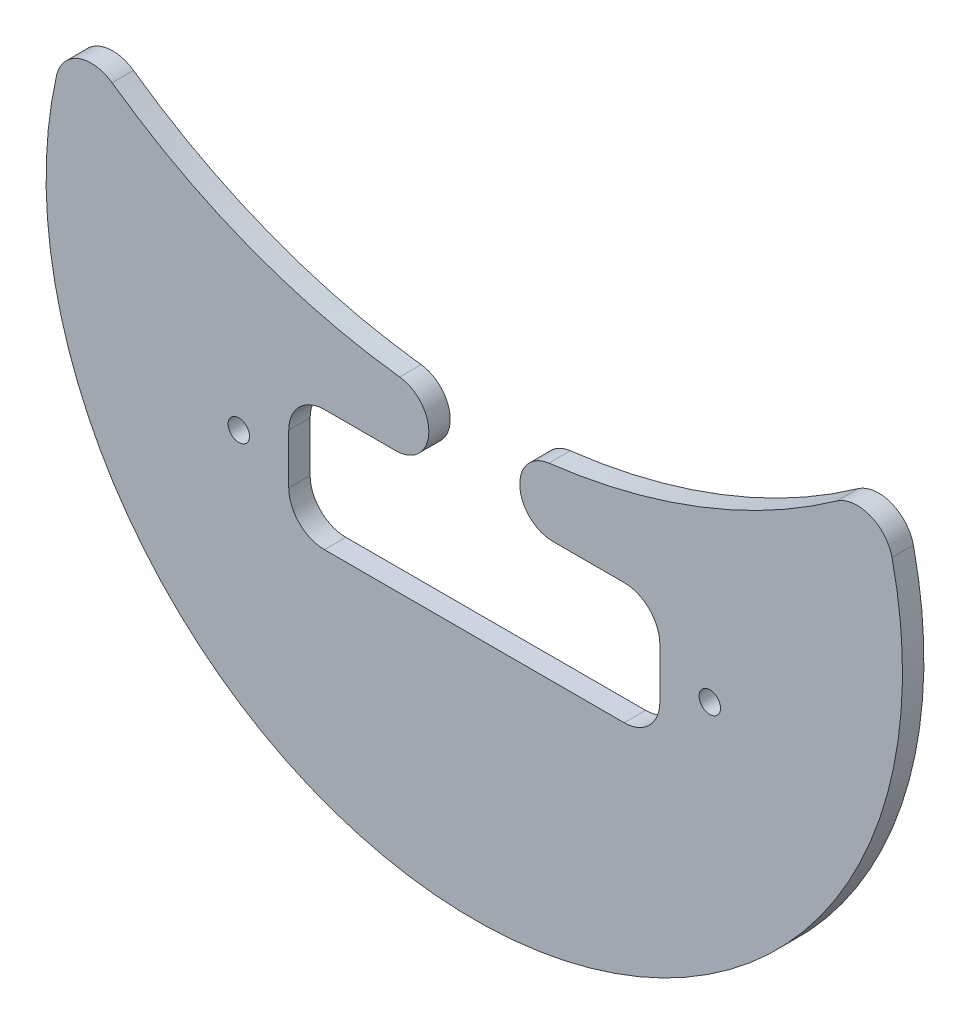
ISO-10303-21;
HEADER;
FILE_DESCRIPTION(('STEP AP214'),'2;1');
FILE_NAME('part.step','',(''),(''),'','','');
FILE_SCHEMA(('AUTOMOTIVE_DESIGN { 1 0 10303 214 1 1 1 1 }'));
ENDSEC;
DATA;
#1=APPLICATION_CONTEXT('core data for automotive mechanical design processes');
#2=APPLICATION_PROTOCOL_DEFINITION('international standard','automotive_design',2000,#1);
#3=PRODUCT_CONTEXT('',#1,'mechanical');
#4=PRODUCT('Part','Part','',(#3));
#5=PRODUCT_RELATED_PRODUCT_CATEGORY('part','',(#4));
#6=PRODUCT_DEFINITION_FORMATION('','',#4);
#7=PRODUCT_DEFINITION_CONTEXT('part definition',#1,'design');
#8=PRODUCT_DEFINITION('design','',#6,#7);
#9=PRODUCT_DEFINITION_SHAPE('','',#8);
#10=(LENGTH_UNIT() NAMED_UNIT(*) SI_UNIT(.MILLI.,.METRE.));
#11=(NAMED_UNIT(*) PLANE_ANGLE_UNIT() SI_UNIT($,.RADIAN.));
#12=(NAMED_UNIT(*) SI_UNIT($,.STERADIAN.) SOLID_ANGLE_UNIT());
#13=UNCERTAINTY_MEASURE_WITH_UNIT(LENGTH_MEASURE(1.E-05),#10,'distance_accuracy_value','');
#14=(GEOMETRIC_REPRESENTATION_CONTEXT(3) GLOBAL_UNCERTAINTY_ASSIGNED_CONTEXT((#13)) GLOBAL_UNIT_ASSIGNED_CONTEXT((#10,
#11,#12)) REPRESENTATION_CONTEXT('',''));
#15=CARTESIAN_POINT('',(0.,0.,0.));
#16=DIRECTION('',(0.,0.,1.));
#17=DIRECTION('',(1.,0.,0.));
#18=AXIS2_PLACEMENT_3D('',#15,#16,#17);
#19=CARTESIAN_POINT('',(0.151407967482101,120.064132004889,3.));
#20=DIRECTION('',(0.,0.,1.));
#21=DIRECTION('',(1.,0.,0.));
#22=AXIS2_PLACEMENT_3D('',#19,#20,#21);
#23=PLANE('',#22);
#24=CARTESIAN_POINT('',(-32.8485920325179,15.25,3.));
#25=DIRECTION('',(0.,0.,1.));
#26=DIRECTION('',(1.,0.,0.));
#27=AXIS2_PLACEMENT_3D('',#24,#25,#26);
#28=CIRCLE('',#27,1.5);
#29=CARTESIAN_POINT('',(-31.3485920325179,15.25,3.));
#30=VERTEX_POINT('',#29);
#31=EDGE_CURVE('E193',#30,#30,#28,.T.);
#32=ORIENTED_EDGE('',*,*,#31,.F.);
#33=EDGE_LOOP('',(#32));
#34=FACE_BOUND('',#33,.T.);
#35=CARTESIAN_POINT('',(0.151407967482101,120.064132004889,3.));
#36=DIRECTION('',(0.,0.,-1.));
#37=DIRECTION('',(1.,0.,0.));
#38=AXIS2_PLACEMENT_3D('',#35,#36,#37);
#39=CIRCLE('',#38,87.71413200489);
#40=CARTESIAN_POINT('',(-10.2972090877304,32.9745496485315,3.));
#41=VERTEX_POINT('',#40);
#42=CARTESIAN_POINT('',(-50.607433463144,48.5287633402081,3.));
#43=VERTEX_POINT('',#42);
#44=EDGE_CURVE('E215',#41,#43,#39,.T.);
#45=ORIENTED_EDGE('',*,*,#44,.T.);
#46=CARTESIAN_POINT('',(-53.5008578333353,44.4510071662832,3.));
#47=DIRECTION('',(0.,0.,1.));
#48=DIRECTION('',(1.,0.,0.));
#49=AXIS2_PLACEMENT_3D('',#46,#47,#48);
#50=CIRCLE('',#49,5.);
#51=CARTESIAN_POINT('',(-58.3783365425006,45.5510987268544,3.));
#52=VERTEX_POINT('',#51);
#53=EDGE_CURVE('E252',#43,#52,#50,.T.);
#54=ORIENTED_EDGE('',*,*,#53,.T.);
#55=CARTESIAN_POINT('',(0.151407967482101,32.35,3.));
#56=DIRECTION('',(0.,0.,1.));
#57=DIRECTION('',(1.,0.,0.));
#58=AXIS2_PLACEMENT_3D('',#55,#56,#57);
#59=CIRCLE('',#58,60.);
#60=CARTESIAN_POINT('',(58.6811524774648,45.5510987268544,3.));
#61=VERTEX_POINT('',#60);
#62=EDGE_CURVE('E156',#52,#61,#59,.T.);
#63=ORIENTED_EDGE('',*,*,#62,.T.);
#64=CARTESIAN_POINT('',(53.8036737682995,44.4510071662832,3.));
#65=DIRECTION('',(0.,0.,1.));
#66=DIRECTION('',(1.,0.,0.));
#67=AXIS2_PLACEMENT_3D('',#64,#65,#66);
#68=CIRCLE('',#67,5.);
#69=CARTESIAN_POINT('',(50.9102493981082,48.5287633402081,3.));
#70=VERTEX_POINT('',#69);
#71=EDGE_CURVE('E49',#61,#70,#68,.T.);
#72=ORIENTED_EDGE('',*,*,#71,.T.);
#73=CARTESIAN_POINT('',(0.151407967482101,120.064132004889,3.));
#74=DIRECTION('',(0.,0.,-1.));
#75=DIRECTION('',(1.,0.,0.));
#76=AXIS2_PLACEMENT_3D('',#73,#74,#75);
#77=CIRCLE('',#76,87.71413200489);
#78=CARTESIAN_POINT('',(10.6000250226946,32.9745496485315,3.));
#79=VERTEX_POINT('',#78);
#80=EDGE_CURVE('E146',#70,#79,#77,.T.);
#81=ORIENTED_EDGE('',*,*,#80,.T.);
#82=CARTESIAN_POINT('',(11.1514079674821,28.3787538483583,3.));
#83=DIRECTION('',(0.,0.,1.));
#84=DIRECTION('',(1.,0.,0.));
#85=AXIS2_PLACEMENT_3D('',#82,#83,#84);
#86=CIRCLE('',#85,4.6287538483584);
#87=CARTESIAN_POINT('',(11.1514079674821,23.7499999999999,3.));
#88=VERTEX_POINT('',#87);
#89=EDGE_CURVE('E151',#79,#88,#86,.T.);
#90=ORIENTED_EDGE('',*,*,#89,.T.);
#91=DIRECTION('',(1.,0.,0.));
#92=VECTOR('',#91,1.);
#93=CARTESIAN_POINT('',(11.1514079674821,23.75,3.));
#94=LINE('',#93,#92);
#95=CARTESIAN_POINT('',(21.1514079674821,23.75,3.));
#96=VERTEX_POINT('',#95);
#97=EDGE_CURVE('E171',#88,#96,#94,.T.);
#98=ORIENTED_EDGE('',*,*,#97,.T.);
#99=CARTESIAN_POINT('',(21.1514079674821,18.75,3.));
#100=DIRECTION('',(0.,0.,1.));
#101=DIRECTION('',(1.,0.,0.));
#102=AXIS2_PLACEMENT_3D('',#99,#100,#101);
#103=CIRCLE('',#102,5.);
#104=CARTESIAN_POINT('',(26.1514079674821,18.75,3.));
#105=VERTEX_POINT('',#104);
#106=EDGE_CURVE('E11',#96,#105,#103,.F.);
#107=ORIENTED_EDGE('',*,*,#106,.T.);
#108=DIRECTION('',(0.,-1.,0.));
#109=VECTOR('',#108,1.);
#110=CARTESIAN_POINT('',(26.1514079674821,6.74999999999998,3.));
#111=LINE('',#110,#109);
#112=CARTESIAN_POINT('',(26.1514079674821,11.75,3.));
#113=VERTEX_POINT('',#112);
#114=EDGE_CURVE('E173',#105,#113,#111,.T.);
#115=ORIENTED_EDGE('',*,*,#114,.T.);
#116=CARTESIAN_POINT('',(21.1514079674821,11.75,3.));
#117=DIRECTION('',(0.,0.,1.));
#118=DIRECTION('',(1.,0.,0.));
#119=AXIS2_PLACEMENT_3D('',#116,#117,#118);
#120=CIRCLE('',#119,5.);
#121=CARTESIAN_POINT('',(21.1514079674821,6.74999999999998,3.));
#122=VERTEX_POINT('',#121);
#123=EDGE_CURVE('E266',#113,#122,#120,.F.);
#124=ORIENTED_EDGE('',*,*,#123,.T.);
#125=DIRECTION('',(-1.,0.,0.));
#126=VECTOR('',#125,1.);
#127=CARTESIAN_POINT('',(-25.8485920325179,6.74999999999998,3.));
#128=LINE('',#127,#126);
#129=CARTESIAN_POINT('',(-20.8485920325179,6.74999999999998,3.));
#130=VERTEX_POINT('',#129);
#131=EDGE_CURVE('E179',#122,#130,#128,.T.);
#132=ORIENTED_EDGE('',*,*,#131,.T.);
#133=CARTESIAN_POINT('',(-20.8485920325179,11.75,3.));
#134=DIRECTION('',(0.,0.,1.));
#135=DIRECTION('',(1.,0.,0.));
#136=AXIS2_PLACEMENT_3D('',#133,#134,#135);
#137=CIRCLE('',#136,5.);
#138=CARTESIAN_POINT('',(-25.8485920325179,11.75,3.));
#139=VERTEX_POINT('',#138);
#140=EDGE_CURVE('E262',#130,#139,#137,.F.);
#141=ORIENTED_EDGE('',*,*,#140,.T.);
#142=DIRECTION('',(0.,1.,0.));
#143=VECTOR('',#142,1.);
#144=CARTESIAN_POINT('',(-25.8485920325179,6.74999999999998,3.));
#145=LINE('',#144,#143);
#146=CARTESIAN_POINT('',(-25.8485920325179,18.75,3.));
#147=VERTEX_POINT('',#146);
#148=EDGE_CURVE('E182',#139,#147,#145,.T.);
#149=ORIENTED_EDGE('',*,*,#148,.T.);
#150=CARTESIAN_POINT('',(-20.8485920325179,18.75,3.));
#151=DIRECTION('',(0.,0.,1.));
#152=DIRECTION('',(1.,0.,0.));
#153=AXIS2_PLACEMENT_3D('',#150,#151,#152);
#154=CIRCLE('',#153,5.);
#155=CARTESIAN_POINT('',(-20.8485920325179,23.75,3.));
#156=VERTEX_POINT('',#155);
#157=EDGE_CURVE('E258',#147,#156,#154,.F.);
#158=ORIENTED_EDGE('',*,*,#157,.T.);
#159=DIRECTION('',(1.,0.,0.));
#160=VECTOR('',#159,1.);
#161=CARTESIAN_POINT('',(-25.8485920325179,23.75,3.));
#162=LINE('',#161,#160);
#163=CARTESIAN_POINT('',(-10.8485920325179,23.75,3.));
#164=VERTEX_POINT('',#163);
#165=EDGE_CURVE('E185',#156,#164,#162,.T.);
#166=ORIENTED_EDGE('',*,*,#165,.T.);
#167=CARTESIAN_POINT('',(-10.8485920325179,28.3787538483583,3.));
#168=DIRECTION('',(0.,0.,1.));
#169=DIRECTION('',(-1.,0.,0.));
#170=AXIS2_PLACEMENT_3D('',#167,#168,#169);
#171=CIRCLE('',#170,4.6287538483584);
#172=EDGE_CURVE('E187',#164,#41,#171,.T.);
#173=ORIENTED_EDGE('',*,*,#172,.T.);
#174=EDGE_LOOP('',(#45,#54,#63,#72,#81,#90,#98,#107,#115,#124,#132,#141,#149,#158,#166,#173));
#175=FACE_BOUND('',#174,.T.);
#176=CARTESIAN_POINT('',(33.1514079674821,15.25,3.));
#177=DIRECTION('',(0.,0.,1.));
#178=DIRECTION('',(1.,0.,0.));
#179=AXIS2_PLACEMENT_3D('',#176,#177,#178);
#180=CIRCLE('',#179,1.5);
#181=CARTESIAN_POINT('',(34.6514079674821,15.25,3.));
#182=VERTEX_POINT('',#181);
#183=EDGE_CURVE('E331',#182,#182,#180,.T.);
#184=ORIENTED_EDGE('',*,*,#183,.F.);
#185=EDGE_LOOP('',(#184));
#186=FACE_BOUND('',#185,.T.);
#187=ADVANCED_FACE('F34',(#34,#175,#186),#23,.T.);
#188=CARTESIAN_POINT('',(0.151407967482101,120.064132004889,0.));
#189=DIRECTION('',(0.,0.,1.));
#190=DIRECTION('',(1.,0.,0.));
#191=AXIS2_PLACEMENT_3D('',#188,#189,#190);
#192=PLANE('',#191);
#193=CARTESIAN_POINT('',(0.151407967482101,32.35,0.));
#194=DIRECTION('',(0.,0.,1.));
#195=DIRECTION('',(1.,0.,0.));
#196=AXIS2_PLACEMENT_3D('',#193,#194,#195);
#197=CIRCLE('',#196,60.);
#198=CARTESIAN_POINT('',(-58.3783365425006,45.5510987268544,0.));
#199=VERTEX_POINT('',#198);
#200=CARTESIAN_POINT('',(58.6811524774648,45.5510987268544,0.));
#201=VERTEX_POINT('',#200);
#202=EDGE_CURVE('E192',#199,#201,#197,.T.);
#203=ORIENTED_EDGE('',*,*,#202,.F.);
#204=CARTESIAN_POINT('',(-53.5008578333353,44.4510071662832,0.));
#205=DIRECTION('',(0.,0.,1.));
#206=DIRECTION('',(1.,0.,0.));
#207=AXIS2_PLACEMENT_3D('',#204,#205,#206);
#208=CIRCLE('',#207,5.);
#209=CARTESIAN_POINT('',(-50.607433463144,48.5287633402081,0.));
#210=VERTEX_POINT('',#209);
#211=EDGE_CURVE('E248',#199,#210,#208,.F.);
#212=ORIENTED_EDGE('',*,*,#211,.T.);
#213=CARTESIAN_POINT('',(0.151407967482101,120.064132004889,0.));
#214=DIRECTION('',(0.,0.,-1.));
#215=DIRECTION('',(1.,0.,0.));
#216=AXIS2_PLACEMENT_3D('',#213,#214,#215);
#217=CIRCLE('',#216,87.71413200489);
#218=CARTESIAN_POINT('',(-10.2972090877304,32.9745496485315,0.));
#219=VERTEX_POINT('',#218);
#220=EDGE_CURVE('E190',#219,#210,#217,.T.);
#221=ORIENTED_EDGE('',*,*,#220,.F.);
#222=CARTESIAN_POINT('',(-10.8485920325179,28.3787538483583,0.));
#223=DIRECTION('',(0.,0.,1.));
#224=DIRECTION('',(-1.,0.,0.));
#225=AXIS2_PLACEMENT_3D('',#222,#223,#224);
#226=CIRCLE('',#225,4.6287538483584);
#227=CARTESIAN_POINT('',(-10.8485920325179,23.75,0.));
#228=VERTEX_POINT('',#227);
#229=EDGE_CURVE('E213',#228,#219,#226,.T.);
#230=ORIENTED_EDGE('',*,*,#229,.F.);
#231=DIRECTION('',(1.,0.,0.));
#232=VECTOR('',#231,1.);
#233=CARTESIAN_POINT('',(-25.8485920325179,23.75,0.));
#234=LINE('',#233,#232);
#235=CARTESIAN_POINT('',(-20.8485920325179,23.75,0.));
#236=VERTEX_POINT('',#235);
#237=EDGE_CURVE('E211',#236,#228,#234,.T.);
#238=ORIENTED_EDGE('',*,*,#237,.F.);
#239=CARTESIAN_POINT('',(-20.8485920325179,18.75,0.));
#240=DIRECTION('',(0.,0.,1.));
#241=DIRECTION('',(1.,0.,0.));
#242=AXIS2_PLACEMENT_3D('',#239,#240,#241);
#243=CIRCLE('',#242,5.);
#244=CARTESIAN_POINT('',(-25.8485920325179,18.75,0.));
#245=VERTEX_POINT('',#244);
#246=EDGE_CURVE('E256',#236,#245,#243,.T.);
#247=ORIENTED_EDGE('',*,*,#246,.T.);
#248=DIRECTION('',(0.,1.,0.));
#249=VECTOR('',#248,1.);
#250=CARTESIAN_POINT('',(-25.8485920325179,6.74999999999998,0.));
#251=LINE('',#250,#249);
#252=CARTESIAN_POINT('',(-25.8485920325179,11.75,0.));
#253=VERTEX_POINT('',#252);
#254=EDGE_CURVE('E208',#253,#245,#251,.T.);
#255=ORIENTED_EDGE('',*,*,#254,.F.);
#256=CARTESIAN_POINT('',(-20.8485920325179,11.75,0.));
#257=DIRECTION('',(0.,0.,1.));
#258=DIRECTION('',(1.,0.,0.));
#259=AXIS2_PLACEMENT_3D('',#256,#257,#258);
#260=CIRCLE('',#259,5.);
#261=CARTESIAN_POINT('',(-20.8485920325179,6.74999999999998,0.));
#262=VERTEX_POINT('',#261);
#263=EDGE_CURVE('E260',#253,#262,#260,.T.);
#264=ORIENTED_EDGE('',*,*,#263,.T.);
#265=DIRECTION('',(-1.,0.,0.));
#266=VECTOR('',#265,1.);
#267=CARTESIAN_POINT('',(-25.8485920325179,6.74999999999998,0.));
#268=LINE('',#267,#266);
#269=CARTESIAN_POINT('',(21.1514079674821,6.74999999999998,0.));
#270=VERTEX_POINT('',#269);
#271=EDGE_CURVE('E205',#270,#262,#268,.T.);
#272=ORIENTED_EDGE('',*,*,#271,.F.);
#273=CARTESIAN_POINT('',(21.1514079674821,11.75,0.));
#274=DIRECTION('',(0.,0.,1.));
#275=DIRECTION('',(1.,0.,0.));
#276=AXIS2_PLACEMENT_3D('',#273,#274,#275);
#277=CIRCLE('',#276,5.);
#278=CARTESIAN_POINT('',(26.1514079674821,11.75,0.));
#279=VERTEX_POINT('',#278);
#280=EDGE_CURVE('E264',#270,#279,#277,.T.);
#281=ORIENTED_EDGE('',*,*,#280,.T.);
#282=DIRECTION('',(0.,-1.,0.));
#283=VECTOR('',#282,1.);
#284=CARTESIAN_POINT('',(26.1514079674821,6.74999999999998,0.));
#285=LINE('',#284,#283);
#286=CARTESIAN_POINT('',(26.1514079674821,18.75,0.));
#287=VERTEX_POINT('',#286);
#288=EDGE_CURVE('E202',#287,#279,#285,.T.);
#289=ORIENTED_EDGE('',*,*,#288,.F.);
#290=CARTESIAN_POINT('',(21.1514079674821,18.75,0.));
#291=DIRECTION('',(0.,0.,1.));
#292=DIRECTION('',(1.,0.,0.));
#293=AXIS2_PLACEMENT_3D('',#290,#291,#292);
#294=CIRCLE('',#293,5.);
#295=CARTESIAN_POINT('',(21.1514079674821,23.75,0.));
#296=VERTEX_POINT('',#295);
#297=EDGE_CURVE('E42',#287,#296,#294,.T.);
#298=ORIENTED_EDGE('',*,*,#297,.T.);
#299=DIRECTION('',(1.,0.,0.));
#300=VECTOR('',#299,1.);
#301=CARTESIAN_POINT('',(11.1514079674821,23.75,0.));
#302=LINE('',#301,#300);
#303=CARTESIAN_POINT('',(11.1514079674821,23.7499999999999,0.));
#304=VERTEX_POINT('',#303);
#305=EDGE_CURVE('E199',#304,#296,#302,.T.);
#306=ORIENTED_EDGE('',*,*,#305,.F.);
#307=CARTESIAN_POINT('',(11.1514079674821,28.3787538483583,0.));
#308=DIRECTION('',(0.,0.,1.));
#309=DIRECTION('',(1.,0.,0.));
#310=AXIS2_PLACEMENT_3D('',#307,#308,#309);
#311=CIRCLE('',#310,4.6287538483584);
#312=CARTESIAN_POINT('',(10.6000250226946,32.9745496485315,0.));
#313=VERTEX_POINT('',#312);
#314=EDGE_CURVE('E197',#313,#304,#311,.T.);
#315=ORIENTED_EDGE('',*,*,#314,.F.);
#316=CARTESIAN_POINT('',(0.151407967482101,120.064132004889,0.));
#317=DIRECTION('',(0.,0.,-1.));
#318=DIRECTION('',(1.,0.,0.));
#319=AXIS2_PLACEMENT_3D('',#316,#317,#318);
#320=CIRCLE('',#319,87.71413200489);
#321=CARTESIAN_POINT('',(50.9102493981082,48.5287633402081,0.));
#322=VERTEX_POINT('',#321);
#323=EDGE_CURVE('E162',#322,#313,#320,.T.);
#324=ORIENTED_EDGE('',*,*,#323,.F.);
#325=CARTESIAN_POINT('',(53.8036737682995,44.4510071662832,0.));
#326=DIRECTION('',(0.,0.,1.));
#327=DIRECTION('',(1.,0.,0.));
#328=AXIS2_PLACEMENT_3D('',#325,#326,#327);
#329=CIRCLE('',#328,5.);
#330=EDGE_CURVE('E246',#322,#201,#329,.F.);
#331=ORIENTED_EDGE('',*,*,#330,.T.);
#332=EDGE_LOOP('',(#203,#212,#221,#230,#238,#247,#255,#264,#272,#281,#289,#298,#306,#315,#324,#331));
#333=FACE_BOUND('',#332,.T.);
#334=CARTESIAN_POINT('',(-32.8485920325179,15.25,0.));
#335=DIRECTION('',(0.,0.,1.));
#336=DIRECTION('',(1.,0.,0.));
#337=AXIS2_PLACEMENT_3D('',#334,#335,#336);
#338=CIRCLE('',#337,1.5);
#339=CARTESIAN_POINT('',(-31.3485920325179,15.25,0.));
#340=VERTEX_POINT('',#339);
#341=EDGE_CURVE('E328',#340,#340,#338,.T.);
#342=ORIENTED_EDGE('',*,*,#341,.T.);
#343=EDGE_LOOP('',(#342));
#344=FACE_BOUND('',#343,.T.);
#345=CARTESIAN_POINT('',(33.1514079674821,15.25,0.));
#346=DIRECTION('',(0.,0.,1.));
#347=DIRECTION('',(1.,0.,0.));
#348=AXIS2_PLACEMENT_3D('',#345,#346,#347);
#349=CIRCLE('',#348,1.5);
#350=CARTESIAN_POINT('',(34.6514079674821,15.25,0.));
#351=VERTEX_POINT('',#350);
#352=EDGE_CURVE('E334',#351,#351,#349,.T.);
#353=ORIENTED_EDGE('',*,*,#352,.T.);
#354=EDGE_LOOP('',(#353));
#355=FACE_BOUND('',#354,.T.);
#356=ADVANCED_FACE('F271',(#333,#344,#355),#192,.F.);
#357=CARTESIAN_POINT('',(0.151407967482101,120.064132004889,3.));
#358=DIRECTION('',(0.,0.,-1.));
#359=DIRECTION('',(-1.,0.,0.));
#360=AXIS2_PLACEMENT_3D('',#357,#358,#359);
#361=CYLINDRICAL_SURFACE('',#360,87.71413200489);
#362=ORIENTED_EDGE('',*,*,#220,.T.);
#363=DIRECTION('',(0.,0.,-1.));
#364=VECTOR('',#363,1.);
#365=CARTESIAN_POINT('',(-50.607433463144,48.5287633402081,3.));
#366=LINE('',#365,#364);
#367=EDGE_CURVE('E57',#210,#43,#366,.F.);
#368=ORIENTED_EDGE('',*,*,#367,.T.);
#369=ORIENTED_EDGE('',*,*,#44,.F.);
#370=DIRECTION('',(0.,0.,-1.));
#371=VECTOR('',#370,1.);
#372=CARTESIAN_POINT('',(-10.2972090877304,32.9745496485315,3.));
#373=LINE('',#372,#371);
#374=EDGE_CURVE('E189',#41,#219,#373,.T.);
#375=ORIENTED_EDGE('',*,*,#374,.T.);
#376=EDGE_LOOP('',(#362,#368,#369,#375));
#377=FACE_BOUND('',#376,.T.);
#378=ADVANCED_FACE('F348',(#377),#361,.F.);
#379=CARTESIAN_POINT('',(0.151407967482101,32.35,3.));
#380=DIRECTION('',(0.,0.,-1.));
#381=DIRECTION('',(-1.,0.,0.));
#382=AXIS2_PLACEMENT_3D('',#379,#380,#381);
#383=CYLINDRICAL_SURFACE('',#382,60.);
#384=ORIENTED_EDGE('',*,*,#62,.F.);
#385=DIRECTION('',(0.,0.,-1.));
#386=VECTOR('',#385,1.);
#387=CARTESIAN_POINT('',(-58.3783365425006,45.5510987268544,3.));
#388=LINE('',#387,#386);
#389=EDGE_CURVE('E243',#52,#199,#388,.T.);
#390=ORIENTED_EDGE('',*,*,#389,.T.);
#391=ORIENTED_EDGE('',*,*,#202,.T.);
#392=DIRECTION('',(0.,0.,-1.));
#393=VECTOR('',#392,1.);
#394=CARTESIAN_POINT('',(58.6811524774648,45.5510987268544,3.));
#395=LINE('',#394,#393);
#396=EDGE_CURVE('E241',#201,#61,#395,.F.);
#397=ORIENTED_EDGE('',*,*,#396,.T.);
#398=EDGE_LOOP('',(#384,#390,#391,#397));
#399=FACE_BOUND('',#398,.T.);
#400=ADVANCED_FACE('F323',(#399),#383,.T.);
#401=CARTESIAN_POINT('',(0.151407967482101,120.064132004889,3.));
#402=DIRECTION('',(0.,0.,-1.));
#403=DIRECTION('',(-1.,0.,0.));
#404=AXIS2_PLACEMENT_3D('',#401,#402,#403);
#405=CYLINDRICAL_SURFACE('',#404,87.71413200489);
#406=ORIENTED_EDGE('',*,*,#80,.F.);
#407=DIRECTION('',(0.,0.,-1.));
#408=VECTOR('',#407,1.);
#409=CARTESIAN_POINT('',(50.9102493981082,48.5287633402081,3.));
#410=LINE('',#409,#408);
#411=EDGE_CURVE('E254',#70,#322,#410,.T.);
#412=ORIENTED_EDGE('',*,*,#411,.T.);
#413=ORIENTED_EDGE('',*,*,#323,.T.);
#414=DIRECTION('',(0.,0.,-1.));
#415=VECTOR('',#414,1.);
#416=CARTESIAN_POINT('',(10.6000250226946,32.9745496485315,3.));
#417=LINE('',#416,#415);
#418=EDGE_CURVE('E159',#79,#313,#417,.T.);
#419=ORIENTED_EDGE('',*,*,#418,.F.);
#420=EDGE_LOOP('',(#406,#412,#413,#419));
#421=FACE_BOUND('',#420,.T.);
#422=ADVANCED_FACE('F160',(#421),#405,.F.);
#423=CARTESIAN_POINT('',(11.1514079674821,28.3787538483583,3.));
#424=DIRECTION('',(0.,0.,-1.));
#425=DIRECTION('',(-1.,0.,0.));
#426=AXIS2_PLACEMENT_3D('',#423,#424,#425);
#427=CYLINDRICAL_SURFACE('',#426,4.6287538483584);
#428=ORIENTED_EDGE('',*,*,#314,.T.);
#429=DIRECTION('',(0.,0.,-1.));
#430=VECTOR('',#429,1.);
#431=CARTESIAN_POINT('',(11.1514079674821,23.7499999999999,3.));
#432=LINE('',#431,#430);
#433=EDGE_CURVE('E166',#88,#304,#432,.T.);
#434=ORIENTED_EDGE('',*,*,#433,.F.);
#435=ORIENTED_EDGE('',*,*,#89,.F.);
#436=ORIENTED_EDGE('',*,*,#418,.T.);
#437=EDGE_LOOP('',(#428,#434,#435,#436));
#438=FACE_BOUND('',#437,.T.);
#439=ADVANCED_FACE('F168',(#438),#427,.T.);
#440=CARTESIAN_POINT('',(11.1514079674821,23.75,3.));
#441=DIRECTION('',(0.,1.,0.));
#442=DIRECTION('',(0.,0.,1.));
#443=AXIS2_PLACEMENT_3D('',#440,#441,#442);
#444=PLANE('',#443);
#445=ORIENTED_EDGE('',*,*,#305,.T.);
#446=DIRECTION('',(0.,0.,-1.));
#447=VECTOR('',#446,1.);
#448=CARTESIAN_POINT('',(21.1514079674821,23.75,3.));
#449=LINE('',#448,#447);
#450=EDGE_CURVE('E239',#296,#96,#449,.F.);
#451=ORIENTED_EDGE('',*,*,#450,.T.);
#452=ORIENTED_EDGE('',*,*,#97,.F.);
#453=ORIENTED_EDGE('',*,*,#433,.T.);
#454=EDGE_LOOP('',(#445,#451,#452,#453));
#455=FACE_BOUND('',#454,.T.);
#456=ADVANCED_FACE('F277',(#455),#444,.F.);
#457=CARTESIAN_POINT('',(26.1514079674821,6.74999999999998,3.));
#458=DIRECTION('',(1.,0.,0.));
#459=DIRECTION('',(0.,0.,-1.));
#460=AXIS2_PLACEMENT_3D('',#457,#458,#459);
#461=PLANE('',#460);
#462=ORIENTED_EDGE('',*,*,#288,.T.);
#463=DIRECTION('',(0.,0.,-1.));
#464=VECTOR('',#463,1.);
#465=CARTESIAN_POINT('',(26.1514079674821,11.75,3.));
#466=LINE('',#465,#464);
#467=EDGE_CURVE('E237',#279,#113,#466,.F.);
#468=ORIENTED_EDGE('',*,*,#467,.T.);
#469=ORIENTED_EDGE('',*,*,#114,.F.);
#470=DIRECTION('',(0.,0.,-1.));
#471=VECTOR('',#470,1.);
#472=CARTESIAN_POINT('',(26.1514079674821,18.75,0.));
#473=LINE('',#472,#471);
#474=EDGE_CURVE('E234',#105,#287,#473,.T.);
#475=ORIENTED_EDGE('',*,*,#474,.T.);
#476=EDGE_LOOP('',(#462,#468,#469,#475));
#477=FACE_BOUND('',#476,.T.);
#478=ADVANCED_FACE('F283',(#477),#461,.F.);
#479=CARTESIAN_POINT('',(-25.8485920325179,6.74999999999998,3.));
#480=DIRECTION('',(0.,-1.,0.));
#481=DIRECTION('',(0.,0.,-1.));
#482=AXIS2_PLACEMENT_3D('',#479,#480,#481);
#483=PLANE('',#482);
#484=ORIENTED_EDGE('',*,*,#271,.T.);
#485=DIRECTION('',(0.,0.,-1.));
#486=VECTOR('',#485,1.);
#487=CARTESIAN_POINT('',(-20.8485920325179,6.74999999999998,3.));
#488=LINE('',#487,#486);
#489=EDGE_CURVE('E232',#262,#130,#488,.F.);
#490=ORIENTED_EDGE('',*,*,#489,.T.);
#491=ORIENTED_EDGE('',*,*,#131,.F.);
#492=DIRECTION('',(0.,0.,-1.));
#493=VECTOR('',#492,1.);
#494=CARTESIAN_POINT('',(21.1514079674821,6.74999999999998,0.));
#495=LINE('',#494,#493);
#496=EDGE_CURVE('E229',#122,#270,#495,.T.);
#497=ORIENTED_EDGE('',*,*,#496,.T.);
#498=EDGE_LOOP('',(#484,#490,#491,#497));
#499=FACE_BOUND('',#498,.T.);
#500=ADVANCED_FACE('F291',(#499),#483,.F.);
#501=CARTESIAN_POINT('',(-25.8485920325179,6.74999999999998,3.));
#502=DIRECTION('',(-1.,0.,0.));
#503=DIRECTION('',(0.,0.,1.));
#504=AXIS2_PLACEMENT_3D('',#501,#502,#503);
#505=PLANE('',#504);
#506=ORIENTED_EDGE('',*,*,#254,.T.);
#507=DIRECTION('',(0.,0.,-1.));
#508=VECTOR('',#507,1.);
#509=CARTESIAN_POINT('',(-25.8485920325179,18.75,3.));
#510=LINE('',#509,#508);
#511=EDGE_CURVE('E227',#245,#147,#510,.F.);
#512=ORIENTED_EDGE('',*,*,#511,.T.);
#513=ORIENTED_EDGE('',*,*,#148,.F.);
#514=DIRECTION('',(0.,0.,-1.));
#515=VECTOR('',#514,1.);
#516=CARTESIAN_POINT('',(-25.8485920325179,11.75,0.));
#517=LINE('',#516,#515);
#518=EDGE_CURVE('E224',#139,#253,#517,.T.);
#519=ORIENTED_EDGE('',*,*,#518,.T.);
#520=EDGE_LOOP('',(#506,#512,#513,#519));
#521=FACE_BOUND('',#520,.T.);
#522=ADVANCED_FACE('F300',(#521),#505,.F.);
#523=CARTESIAN_POINT('',(-25.8485920325179,23.75,3.));
#524=DIRECTION('',(0.,1.,0.));
#525=DIRECTION('',(0.,0.,1.));
#526=AXIS2_PLACEMENT_3D('',#523,#524,#525);
#527=PLANE('',#526);
#528=ORIENTED_EDGE('',*,*,#165,.F.);
#529=DIRECTION('',(0.,0.,-1.));
#530=VECTOR('',#529,1.);
#531=CARTESIAN_POINT('',(-20.8485920325179,23.75,0.));
#532=LINE('',#531,#530);
#533=EDGE_CURVE('E165',#156,#236,#532,.T.);
#534=ORIENTED_EDGE('',*,*,#533,.T.);
#535=ORIENTED_EDGE('',*,*,#237,.T.);
#536=DIRECTION('',(0.,0.,-1.));
#537=VECTOR('',#536,1.);
#538=CARTESIAN_POINT('',(-10.8485920325179,23.75,3.));
#539=LINE('',#538,#537);
#540=EDGE_CURVE('E218',#164,#228,#539,.T.);
#541=ORIENTED_EDGE('',*,*,#540,.F.);
#542=EDGE_LOOP('',(#528,#534,#535,#541));
#543=FACE_BOUND('',#542,.T.);
#544=ADVANCED_FACE('F309',(#543),#527,.F.);
#545=CARTESIAN_POINT('',(-10.8485920325179,28.3787538483583,3.));
#546=DIRECTION('',(0.,0.,-1.));
#547=DIRECTION('',(-1.,0.,0.));
#548=AXIS2_PLACEMENT_3D('',#545,#546,#547);
#549=CYLINDRICAL_SURFACE('',#548,4.6287538483584);
#550=ORIENTED_EDGE('',*,*,#229,.T.);
#551=ORIENTED_EDGE('',*,*,#374,.F.);
#552=ORIENTED_EDGE('',*,*,#172,.F.);
#553=ORIENTED_EDGE('',*,*,#540,.T.);
#554=EDGE_LOOP('',(#550,#551,#552,#553));
#555=FACE_BOUND('',#554,.T.);
#556=ADVANCED_FACE('F315',(#555),#549,.T.);
#557=CARTESIAN_POINT('',(-32.8485920325179,15.25,3.));
#558=DIRECTION('',(0.,0.,-1.));
#559=DIRECTION('',(-1.,0.,0.));
#560=AXIS2_PLACEMENT_3D('',#557,#558,#559);
#561=CYLINDRICAL_SURFACE('',#560,1.5);
#562=ORIENTED_EDGE('',*,*,#31,.T.);
#563=EDGE_LOOP('',(#562));
#564=FACE_BOUND('',#563,.T.);
#565=ORIENTED_EDGE('',*,*,#341,.F.);
#566=EDGE_LOOP('',(#565));
#567=FACE_BOUND('',#566,.T.);
#568=ADVANCED_FACE('F352',(#564,#567),#561,.F.);
#569=CARTESIAN_POINT('',(33.1514079674821,15.25,3.));
#570=DIRECTION('',(0.,0.,-1.));
#571=DIRECTION('',(-1.,0.,0.));
#572=AXIS2_PLACEMENT_3D('',#569,#570,#571);
#573=CYLINDRICAL_SURFACE('',#572,1.5);
#574=ORIENTED_EDGE('',*,*,#183,.T.);
#575=EDGE_LOOP('',(#574));
#576=FACE_BOUND('',#575,.T.);
#577=ORIENTED_EDGE('',*,*,#352,.F.);
#578=EDGE_LOOP('',(#577));
#579=FACE_BOUND('',#578,.T.);
#580=ADVANCED_FACE('F340',(#576,#579),#573,.F.);
#581=CARTESIAN_POINT('',(-20.8485920325179,18.75,3.));
#582=DIRECTION('',(0.,0.,1.));
#583=DIRECTION('',(1.,0.,0.));
#584=AXIS2_PLACEMENT_3D('',#581,#582,#583);
#585=CYLINDRICAL_SURFACE('',#584,5.);
#586=ORIENTED_EDGE('',*,*,#157,.F.);
#587=ORIENTED_EDGE('',*,*,#511,.F.);
#588=ORIENTED_EDGE('',*,*,#246,.F.);
#589=ORIENTED_EDGE('',*,*,#533,.F.);
#590=EDGE_LOOP('',(#586,#587,#588,#589));
#591=FACE_BOUND('',#590,.T.);
#592=ADVANCED_FACE('F304',(#591),#585,.F.);
#593=CARTESIAN_POINT('',(-20.8485920325179,11.75,3.));
#594=DIRECTION('',(0.,0.,1.));
#595=DIRECTION('',(1.,0.,0.));
#596=AXIS2_PLACEMENT_3D('',#593,#594,#595);
#597=CYLINDRICAL_SURFACE('',#596,5.);
#598=ORIENTED_EDGE('',*,*,#140,.F.);
#599=ORIENTED_EDGE('',*,*,#489,.F.);
#600=ORIENTED_EDGE('',*,*,#263,.F.);
#601=ORIENTED_EDGE('',*,*,#518,.F.);
#602=EDGE_LOOP('',(#598,#599,#600,#601));
#603=FACE_BOUND('',#602,.T.);
#604=ADVANCED_FACE('F295',(#603),#597,.F.);
#605=CARTESIAN_POINT('',(21.1514079674821,11.75,3.));
#606=DIRECTION('',(0.,0.,1.));
#607=DIRECTION('',(1.,0.,0.));
#608=AXIS2_PLACEMENT_3D('',#605,#606,#607);
#609=CYLINDRICAL_SURFACE('',#608,5.);
#610=ORIENTED_EDGE('',*,*,#123,.F.);
#611=ORIENTED_EDGE('',*,*,#467,.F.);
#612=ORIENTED_EDGE('',*,*,#280,.F.);
#613=ORIENTED_EDGE('',*,*,#496,.F.);
#614=EDGE_LOOP('',(#610,#611,#612,#613));
#615=FACE_BOUND('',#614,.T.);
#616=ADVANCED_FACE('F286',(#615),#609,.F.);
#617=CARTESIAN_POINT('',(21.1514079674821,18.75,3.));
#618=DIRECTION('',(0.,0.,1.));
#619=DIRECTION('',(1.,0.,0.));
#620=AXIS2_PLACEMENT_3D('',#617,#618,#619);
#621=CYLINDRICAL_SURFACE('',#620,5.);
#622=ORIENTED_EDGE('',*,*,#106,.F.);
#623=ORIENTED_EDGE('',*,*,#450,.F.);
#624=ORIENTED_EDGE('',*,*,#297,.F.);
#625=ORIENTED_EDGE('',*,*,#474,.F.);
#626=EDGE_LOOP('',(#622,#623,#624,#625));
#627=FACE_BOUND('',#626,.T.);
#628=ADVANCED_FACE('F279',(#627),#621,.F.);
#629=CARTESIAN_POINT('',(-53.5008578333353,44.4510071662832,3.));
#630=DIRECTION('',(0.,0.,1.));
#631=DIRECTION('',(1.,0.,0.));
#632=AXIS2_PLACEMENT_3D('',#629,#630,#631);
#633=CYLINDRICAL_SURFACE('',#632,5.);
#634=ORIENTED_EDGE('',*,*,#53,.F.);
#635=ORIENTED_EDGE('',*,*,#367,.F.);
#636=ORIENTED_EDGE('',*,*,#211,.F.);
#637=ORIENTED_EDGE('',*,*,#389,.F.);
#638=EDGE_LOOP('',(#634,#635,#636,#637));
#639=FACE_BOUND('',#638,.T.);
#640=ADVANCED_FACE('F321',(#639),#633,.T.);
#641=CARTESIAN_POINT('',(53.8036737682995,44.4510071662832,3.));
#642=DIRECTION('',(0.,0.,1.));
#643=DIRECTION('',(1.,0.,0.));
#644=AXIS2_PLACEMENT_3D('',#641,#642,#643);
#645=CYLINDRICAL_SURFACE('',#644,5.);
#646=ORIENTED_EDGE('',*,*,#71,.F.);
#647=ORIENTED_EDGE('',*,*,#396,.F.);
#648=ORIENTED_EDGE('',*,*,#330,.F.);
#649=ORIENTED_EDGE('',*,*,#411,.F.);
#650=EDGE_LOOP('',(#646,#647,#648,#649));
#651=FACE_BOUND('',#650,.T.);
#652=ADVANCED_FACE('F36',(#651),#645,.T.);
#653=CLOSED_SHELL('',(#187,#356,#378,#400,#422,#439,#456,#478,#500,#522,#544,#556,#568,#580,
#592,#604,#616,#628,#640,#652));
#654=MANIFOLD_SOLID_BREP('B2',#653);
#655=ADVANCED_BREP_SHAPE_REPRESENTATION('',(#18,#654),#14);
#656=SHAPE_DEFINITION_REPRESENTATION(#9,#655);
ENDSEC;
END-ISO-10303-21;
